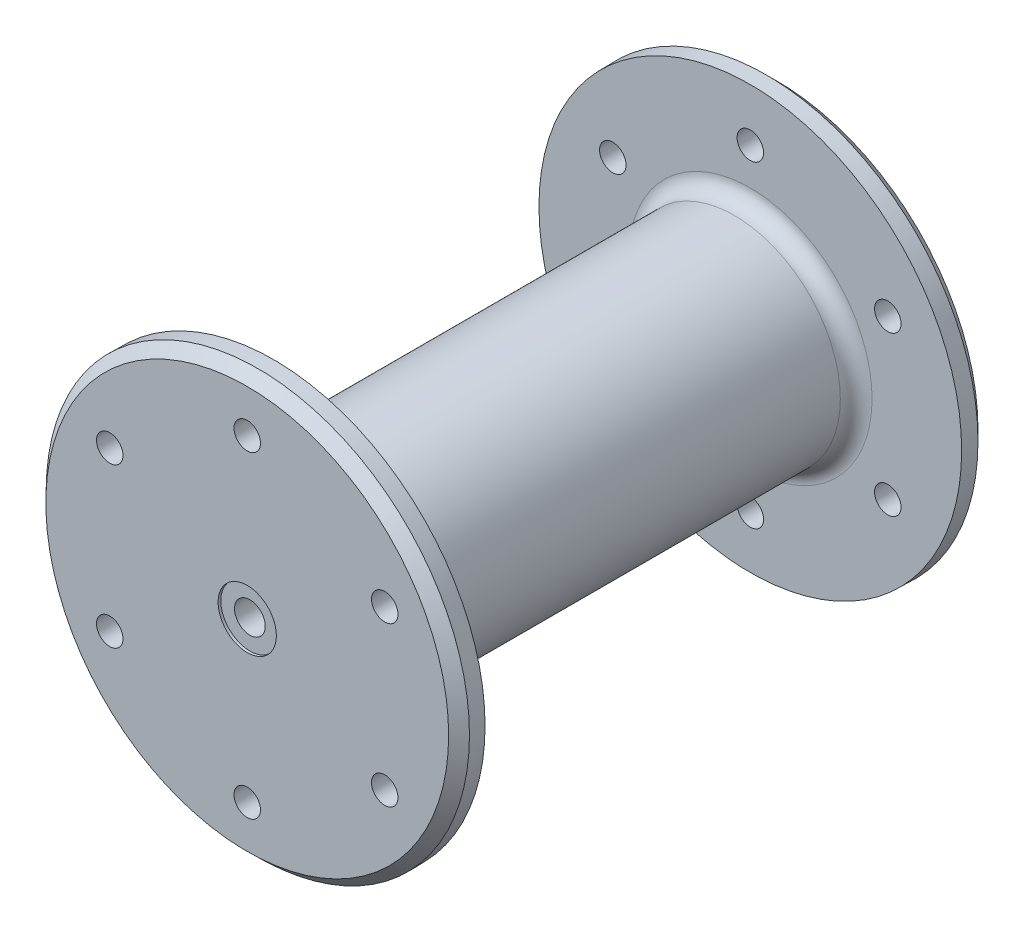
ISO-10303-21;
HEADER;
FILE_DESCRIPTION(('STEP AP214'),'2;1');
FILE_NAME('part.step','',(''),(''),'','','');
FILE_SCHEMA(('AUTOMOTIVE_DESIGN { 1 0 10303 214 1 1 1 1 }'));
ENDSEC;
DATA;
#1=APPLICATION_CONTEXT('core data for automotive mechanical design processes');
#2=APPLICATION_PROTOCOL_DEFINITION('international standard','automotive_design',2000,#1);
#3=PRODUCT_CONTEXT('',#1,'mechanical');
#4=PRODUCT('Part','Part','',(#3));
#5=PRODUCT_RELATED_PRODUCT_CATEGORY('part','',(#4));
#6=PRODUCT_DEFINITION_FORMATION('','',#4);
#7=PRODUCT_DEFINITION_CONTEXT('part definition',#1,'design');
#8=PRODUCT_DEFINITION('design','',#6,#7);
#9=PRODUCT_DEFINITION_SHAPE('','',#8);
#10=(LENGTH_UNIT() NAMED_UNIT(*) SI_UNIT(.MILLI.,.METRE.));
#11=(NAMED_UNIT(*) PLANE_ANGLE_UNIT() SI_UNIT($,.RADIAN.));
#12=(NAMED_UNIT(*) SI_UNIT($,.STERADIAN.) SOLID_ANGLE_UNIT());
#13=UNCERTAINTY_MEASURE_WITH_UNIT(LENGTH_MEASURE(1.E-05),#10,'distance_accuracy_value','');
#14=(GEOMETRIC_REPRESENTATION_CONTEXT(3) GLOBAL_UNCERTAINTY_ASSIGNED_CONTEXT((#13)) GLOBAL_UNIT_ASSIGNED_CONTEXT((#10,
#11,#12)) REPRESENTATION_CONTEXT('',''));
#15=CARTESIAN_POINT('',(0.,0.,0.));
#16=DIRECTION('',(0.,0.,1.));
#17=DIRECTION('',(1.,0.,0.));
#18=AXIS2_PLACEMENT_3D('',#15,#16,#17);
#19=CARTESIAN_POINT('',(0.,0.,50.));
#20=DIRECTION('',(0.,0.,-1.));
#21=DIRECTION('',(-1.,0.,0.));
#22=AXIS2_PLACEMENT_3D('',#19,#20,#21);
#23=CYLINDRICAL_SURFACE('',#22,20.);
#24=CARTESIAN_POINT('',(0.,0.,-42.));
#25=DIRECTION('',(0.,0.,-1.));
#26=DIRECTION('',(-1.,0.,0.));
#27=AXIS2_PLACEMENT_3D('',#24,#25,#26);
#28=CIRCLE('',#27,20.);
#29=CARTESIAN_POINT('',(-20.,0.,-42.));
#30=VERTEX_POINT('',#29);
#31=EDGE_CURVE('E10',#30,#30,#28,.F.);
#32=ORIENTED_EDGE('',*,*,#31,.T.);
#33=EDGE_LOOP('',(#32));
#34=FACE_BOUND('',#33,.T.);
#35=CARTESIAN_POINT('',(0.,0.,42.));
#36=DIRECTION('',(0.,0.,1.));
#37=DIRECTION('',(1.,0.,0.));
#38=AXIS2_PLACEMENT_3D('',#35,#36,#37);
#39=CIRCLE('',#38,20.);
#40=CARTESIAN_POINT('',(20.,0.,42.));
#41=VERTEX_POINT('',#40);
#42=EDGE_CURVE('E61',#41,#41,#39,.F.);
#43=ORIENTED_EDGE('',*,*,#42,.T.);
#44=EDGE_LOOP('',(#43));
#45=FACE_BOUND('',#44,.T.);
#46=ADVANCED_FACE('F37',(#34,#45),#23,.T.);
#47=CARTESIAN_POINT('',(0.,0.,50.));
#48=DIRECTION('',(0.,0.,1.));
#49=DIRECTION('',(1.,0.,0.));
#50=AXIS2_PLACEMENT_3D('',#47,#48,#49);
#51=CYLINDRICAL_SURFACE('',#50,2.89999999999999);
#52=CARTESIAN_POINT('',(0.,0.,49.5));
#53=DIRECTION('',(0.,0.,1.));
#54=DIRECTION('',(1.,0.,0.));
#55=AXIS2_PLACEMENT_3D('',#52,#53,#54);
#56=CIRCLE('',#55,2.9);
#57=CARTESIAN_POINT('',(2.9,0.,49.5));
#58=VERTEX_POINT('',#57);
#59=EDGE_CURVE('E119',#58,#58,#56,.T.);
#60=ORIENTED_EDGE('',*,*,#59,.T.);
#61=EDGE_LOOP('',(#60));
#62=FACE_BOUND('',#61,.T.);
#63=CARTESIAN_POINT('',(0.,0.,-49.5));
#64=DIRECTION('',(0.,0.,-1.));
#65=DIRECTION('',(-1.,0.,0.));
#66=AXIS2_PLACEMENT_3D('',#63,#64,#65);
#67=CIRCLE('',#66,2.9);
#68=CARTESIAN_POINT('',(-2.9,0.,-49.5));
#69=VERTEX_POINT('',#68);
#70=EDGE_CURVE('E193',#69,#69,#67,.T.);
#71=ORIENTED_EDGE('',*,*,#70,.T.);
#72=EDGE_LOOP('',(#71));
#73=FACE_BOUND('',#72,.T.);
#74=ADVANCED_FACE('F251',(#62,#73),#51,.F.);
#75=CARTESIAN_POINT('',(0.,0.,50.));
#76=DIRECTION('',(0.,0.,1.));
#77=DIRECTION('',(1.,0.,0.));
#78=AXIS2_PLACEMENT_3D('',#75,#76,#77);
#79=CONICAL_SURFACE('',#78,40.,0.0174532925199433);
#80=CARTESIAN_POINT('',(0.,0.,48.0003046096873));
#81=DIRECTION('',(0.,0.,-1.));
#82=DIRECTION('',(-1.,0.,0.));
#83=AXIS2_PLACEMENT_3D('',#80,#81,#82);
#84=CIRCLE('',#83,39.9650951871254);
#85=CARTESIAN_POINT('',(-39.9650951871254,0.,48.0003046096873));
#86=VERTEX_POINT('',#85);
#87=EDGE_CURVE('E69',#86,#86,#84,.T.);
#88=ORIENTED_EDGE('',*,*,#87,.T.);
#89=EDGE_LOOP('',(#88));
#90=FACE_BOUND('',#89,.T.);
#91=CARTESIAN_POINT('',(0.,0.,45.));
#92=DIRECTION('',(0.,0.,1.));
#93=DIRECTION('',(1.,0.,0.));
#94=AXIS2_PLACEMENT_3D('',#91,#92,#93);
#95=CIRCLE('',#94,39.9127246753589);
#96=CARTESIAN_POINT('',(39.9127246753589,0.,45.));
#97=VERTEX_POINT('',#96);
#98=EDGE_CURVE('E77',#97,#97,#95,.T.);
#99=ORIENTED_EDGE('',*,*,#98,.T.);
#100=EDGE_LOOP('',(#99));
#101=FACE_BOUND('',#100,.T.);
#102=ADVANCED_FACE('F256',(#90,#101),#79,.T.);
#103=CARTESIAN_POINT('',(0.,0.,45.));
#104=DIRECTION('',(0.,0.,1.));
#105=DIRECTION('',(1.,0.,0.));
#106=AXIS2_PLACEMENT_3D('',#103,#104,#105);
#107=PLANE('',#106);
#108=CARTESIAN_POINT('',(0.,0.,45.));
#109=DIRECTION('',(0.,0.,1.));
#110=DIRECTION('',(1.,0.,0.));
#111=AXIS2_PLACEMENT_3D('',#108,#109,#110);
#112=CIRCLE('',#111,23.);
#113=CARTESIAN_POINT('',(23.,0.,45.));
#114=VERTEX_POINT('',#113);
#115=EDGE_CURVE('E65',#114,#114,#112,.T.);
#116=ORIENTED_EDGE('',*,*,#115,.T.);
#117=EDGE_LOOP('',(#116));
#118=FACE_BOUND('',#117,.T.);
#119=CARTESIAN_POINT('',(-25.9656478862011,14.9912737967817,45.));
#120=DIRECTION('',(0.,0.,1.));
#121=DIRECTION('',(1.,0.,0.));
#122=AXIS2_PLACEMENT_3D('',#119,#120,#121);
#123=CIRCLE('',#122,2.5);
#124=CARTESIAN_POINT('',(-23.4656478862011,14.9912737967817,45.));
#125=VERTEX_POINT('',#124);
#126=EDGE_CURVE('E89',#125,#125,#123,.T.);
#127=ORIENTED_EDGE('',*,*,#126,.T.);
#128=EDGE_LOOP('',(#127));
#129=FACE_BOUND('',#128,.T.);
#130=CARTESIAN_POINT('',(-25.9656478862014,-14.9912737967811,45.));
#131=DIRECTION('',(0.,0.,1.));
#132=DIRECTION('',(1.,0.,0.));
#133=AXIS2_PLACEMENT_3D('',#130,#131,#132);
#134=CIRCLE('',#133,2.5);
#135=CARTESIAN_POINT('',(-23.4656478862014,-14.9912737967811,45.));
#136=VERTEX_POINT('',#135);
#137=EDGE_CURVE('E93',#136,#136,#134,.T.);
#138=ORIENTED_EDGE('',*,*,#137,.T.);
#139=EDGE_LOOP('',(#138));
#140=FACE_BOUND('',#139,.T.);
#141=CARTESIAN_POINT('',(0.,-29.9825475935627,45.));
#142=DIRECTION('',(0.,0.,1.));
#143=DIRECTION('',(1.,0.,0.));
#144=AXIS2_PLACEMENT_3D('',#141,#142,#143);
#145=CIRCLE('',#144,2.5);
#146=CARTESIAN_POINT('',(2.5,-29.9825475935627,45.));
#147=VERTEX_POINT('',#146);
#148=EDGE_CURVE('E97',#147,#147,#145,.T.);
#149=ORIENTED_EDGE('',*,*,#148,.T.);
#150=EDGE_LOOP('',(#149));
#151=FACE_BOUND('',#150,.T.);
#152=CARTESIAN_POINT('',(25.9656478862012,-14.9912737967815,45.));
#153=DIRECTION('',(0.,0.,1.));
#154=DIRECTION('',(1.,0.,0.));
#155=AXIS2_PLACEMENT_3D('',#152,#153,#154);
#156=CIRCLE('',#155,2.5);
#157=CARTESIAN_POINT('',(28.4656478862012,-14.9912737967815,45.));
#158=VERTEX_POINT('',#157);
#159=EDGE_CURVE('E101',#158,#158,#156,.T.);
#160=ORIENTED_EDGE('',*,*,#159,.T.);
#161=EDGE_LOOP('',(#160));
#162=FACE_BOUND('',#161,.T.);
#163=CARTESIAN_POINT('',(25.9656478862013,14.9912737967813,45.));
#164=DIRECTION('',(0.,0.,1.));
#165=DIRECTION('',(1.,0.,0.));
#166=AXIS2_PLACEMENT_3D('',#163,#164,#165);
#167=CIRCLE('',#166,2.5);
#168=CARTESIAN_POINT('',(28.4656478862013,14.9912737967813,45.));
#169=VERTEX_POINT('',#168);
#170=EDGE_CURVE('E105',#169,#169,#167,.T.);
#171=ORIENTED_EDGE('',*,*,#170,.T.);
#172=EDGE_LOOP('',(#171));
#173=FACE_BOUND('',#172,.T.);
#174=CARTESIAN_POINT('',(0.,29.9825475935627,45.));
#175=DIRECTION('',(0.,0.,1.));
#176=DIRECTION('',(1.,0.,0.));
#177=AXIS2_PLACEMENT_3D('',#174,#175,#176);
#178=CIRCLE('',#177,2.5);
#179=CARTESIAN_POINT('',(2.5,29.9825475935627,45.));
#180=VERTEX_POINT('',#179);
#181=EDGE_CURVE('E81',#180,#180,#178,.T.);
#182=ORIENTED_EDGE('',*,*,#181,.T.);
#183=EDGE_LOOP('',(#182));
#184=FACE_BOUND('',#183,.T.);
#185=ORIENTED_EDGE('',*,*,#98,.F.);
#186=EDGE_LOOP('',(#185));
#187=FACE_BOUND('',#186,.T.);
#188=ADVANCED_FACE('F285',(#118,#129,#140,#151,#162,#173,#184,#187),#107,.F.);
#189=CARTESIAN_POINT('',(0.,0.,50.));
#190=DIRECTION('',(0.,0.,1.));
#191=DIRECTION('',(1.,0.,0.));
#192=AXIS2_PLACEMENT_3D('',#189,#190,#191);
#193=PLANE('',#192);
#194=CARTESIAN_POINT('',(0.,0.,50.));
#195=DIRECTION('',(0.,0.,1.));
#196=DIRECTION('',(1.,0.,0.));
#197=AXIS2_PLACEMENT_3D('',#194,#195,#196);
#198=CIRCLE('',#197,5.49999999999999);
#199=CARTESIAN_POINT('',(5.49999999999999,0.,50.));
#200=VERTEX_POINT('',#199);
#201=EDGE_CURVE('E137',#200,#200,#198,.T.);
#202=ORIENTED_EDGE('',*,*,#201,.F.);
#203=EDGE_LOOP('',(#202));
#204=FACE_BOUND('',#203,.T.);
#205=CARTESIAN_POINT('',(-25.9656478862011,14.9912737967817,50.));
#206=DIRECTION('',(0.,0.,1.));
#207=DIRECTION('',(0.50000000000001,0.866025403784433,0.));
#208=AXIS2_PLACEMENT_3D('',#205,#206,#207);
#209=CIRCLE('',#208,2.5);
#210=CARTESIAN_POINT('',(-24.7156478862011,17.1563373062427,50.));
#211=VERTEX_POINT('',#210);
#212=EDGE_CURVE('E114',#211,#211,#209,.T.);
#213=ORIENTED_EDGE('',*,*,#212,.F.);
#214=EDGE_LOOP('',(#213));
#215=FACE_BOUND('',#214,.T.);
#216=CARTESIAN_POINT('',(-25.9656478862014,-14.9912737967811,50.));
#217=DIRECTION('',(0.,0.,1.));
#218=DIRECTION('',(-0.499999999999992,0.866025403784443,0.));
#219=AXIS2_PLACEMENT_3D('',#216,#217,#218);
#220=CIRCLE('',#219,2.5);
#221=CARTESIAN_POINT('',(-27.2156478862014,-12.82621028732,50.));
#222=VERTEX_POINT('',#221);
#223=EDGE_CURVE('E118',#222,#222,#220,.T.);
#224=ORIENTED_EDGE('',*,*,#223,.F.);
#225=EDGE_LOOP('',(#224));
#226=FACE_BOUND('',#225,.T.);
#227=CARTESIAN_POINT('',(0.,-29.9825475935627,50.));
#228=DIRECTION('',(0.,0.,1.));
#229=DIRECTION('',(-1.,0.,0.));
#230=AXIS2_PLACEMENT_3D('',#227,#228,#229);
#231=CIRCLE('',#230,2.5);
#232=CARTESIAN_POINT('',(-2.5,-29.9825475935627,50.));
#233=VERTEX_POINT('',#232);
#234=EDGE_CURVE('E123',#233,#233,#231,.T.);
#235=ORIENTED_EDGE('',*,*,#234,.F.);
#236=EDGE_LOOP('',(#235));
#237=FACE_BOUND('',#236,.T.);
#238=CARTESIAN_POINT('',(25.9656478862012,-14.9912737967815,50.));
#239=DIRECTION('',(0.,0.,1.));
#240=DIRECTION('',(-0.500000000000004,-0.866025403784436,0.));
#241=AXIS2_PLACEMENT_3D('',#238,#239,#240);
#242=CIRCLE('',#241,2.5);
#243=CARTESIAN_POINT('',(24.7156478862012,-17.1563373062426,50.));
#244=VERTEX_POINT('',#243);
#245=EDGE_CURVE('E113',#244,#244,#242,.T.);
#246=ORIENTED_EDGE('',*,*,#245,.F.);
#247=EDGE_LOOP('',(#246));
#248=FACE_BOUND('',#247,.T.);
#249=CARTESIAN_POINT('',(25.9656478862013,14.9912737967813,50.));
#250=DIRECTION('',(0.,0.,1.));
#251=DIRECTION('',(0.499999999999998,-0.86602540378444,0.));
#252=AXIS2_PLACEMENT_3D('',#249,#250,#251);
#253=CIRCLE('',#252,2.5);
#254=CARTESIAN_POINT('',(27.2156478862013,12.8262102873202,50.));
#255=VERTEX_POINT('',#254);
#256=EDGE_CURVE('E109',#255,#255,#253,.T.);
#257=ORIENTED_EDGE('',*,*,#256,.F.);
#258=EDGE_LOOP('',(#257));
#259=FACE_BOUND('',#258,.T.);
#260=CARTESIAN_POINT('',(0.,29.9825475935627,50.));
#261=DIRECTION('',(0.,0.,1.));
#262=DIRECTION('',(1.,0.,0.));
#263=AXIS2_PLACEMENT_3D('',#260,#261,#262);
#264=CIRCLE('',#263,2.5);
#265=CARTESIAN_POINT('',(2.5,29.9825475935627,50.));
#266=VERTEX_POINT('',#265);
#267=EDGE_CURVE('E85',#266,#266,#264,.T.);
#268=ORIENTED_EDGE('',*,*,#267,.F.);
#269=EDGE_LOOP('',(#268));
#270=FACE_BOUND('',#269,.T.);
#271=CARTESIAN_POINT('',(0.,0.,50.));
#272=DIRECTION('',(0.,0.,1.));
#273=DIRECTION('',(1.,0.,0.));
#274=AXIS2_PLACEMENT_3D('',#271,#272,#273);
#275=CIRCLE('',#274,38.034011795667);
#276=CARTESIAN_POINT('',(38.034011795667,0.,50.));
#277=VERTEX_POINT('',#276);
#278=EDGE_CURVE('E73',#277,#277,#275,.T.);
#279=ORIENTED_EDGE('',*,*,#278,.T.);
#280=EDGE_LOOP('',(#279));
#281=FACE_BOUND('',#280,.T.);
#282=ADVANCED_FACE('F266',(#204,#215,#226,#237,#248,#259,#270,#281),#193,.T.);
#283=CARTESIAN_POINT('',(0.,0.,50.));
#284=DIRECTION('',(0.,0.,-1.));
#285=DIRECTION('',(-1.,0.,0.));
#286=AXIS2_PLACEMENT_3D('',#283,#284,#285);
#287=CONICAL_SURFACE('',#286,38.034011795667,0.767944870877499);
#288=ORIENTED_EDGE('',*,*,#87,.F.);
#289=EDGE_LOOP('',(#288));
#290=FACE_BOUND('',#289,.T.);
#291=ORIENTED_EDGE('',*,*,#278,.F.);
#292=EDGE_LOOP('',(#291));
#293=FACE_BOUND('',#292,.T.);
#294=ADVANCED_FACE('F262',(#290,#293),#287,.T.);
#295=CARTESIAN_POINT('',(0.,29.9825475935627,-50.));
#296=DIRECTION('',(0.,0.,1.));
#297=DIRECTION('',(1.,0.,0.));
#298=AXIS2_PLACEMENT_3D('',#295,#296,#297);
#299=CYLINDRICAL_SURFACE('',#298,2.5);
#300=ORIENTED_EDGE('',*,*,#267,.T.);
#301=EDGE_LOOP('',(#300));
#302=FACE_BOUND('',#301,.T.);
#303=ORIENTED_EDGE('',*,*,#181,.F.);
#304=EDGE_LOOP('',(#303));
#305=FACE_BOUND('',#304,.T.);
#306=ADVANCED_FACE('F265',(#302,#305),#299,.F.);
#307=CARTESIAN_POINT('',(25.9656478862013,14.9912737967813,-50.));
#308=DIRECTION('',(0.,0.,1.));
#309=DIRECTION('',(1.,0.,0.));
#310=AXIS2_PLACEMENT_3D('',#307,#308,#309);
#311=CYLINDRICAL_SURFACE('',#310,2.5);
#312=ORIENTED_EDGE('',*,*,#256,.T.);
#313=EDGE_LOOP('',(#312));
#314=FACE_BOUND('',#313,.T.);
#315=ORIENTED_EDGE('',*,*,#170,.F.);
#316=EDGE_LOOP('',(#315));
#317=FACE_BOUND('',#316,.T.);
#318=ADVANCED_FACE('F332',(#314,#317),#311,.F.);
#319=CARTESIAN_POINT('',(25.9656478862012,-14.9912737967815,-50.));
#320=DIRECTION('',(0.,0.,1.));
#321=DIRECTION('',(1.,0.,0.));
#322=AXIS2_PLACEMENT_3D('',#319,#320,#321);
#323=CYLINDRICAL_SURFACE('',#322,2.5);
#324=ORIENTED_EDGE('',*,*,#245,.T.);
#325=EDGE_LOOP('',(#324));
#326=FACE_BOUND('',#325,.T.);
#327=ORIENTED_EDGE('',*,*,#159,.F.);
#328=EDGE_LOOP('',(#327));
#329=FACE_BOUND('',#328,.T.);
#330=ADVANCED_FACE('F336',(#326,#329),#323,.F.);
#331=CARTESIAN_POINT('',(0.,-29.9825475935627,-50.));
#332=DIRECTION('',(0.,0.,1.));
#333=DIRECTION('',(1.,0.,0.));
#334=AXIS2_PLACEMENT_3D('',#331,#332,#333);
#335=CYLINDRICAL_SURFACE('',#334,2.5);
#336=ORIENTED_EDGE('',*,*,#234,.T.);
#337=EDGE_LOOP('',(#336));
#338=FACE_BOUND('',#337,.T.);
#339=ORIENTED_EDGE('',*,*,#148,.F.);
#340=EDGE_LOOP('',(#339));
#341=FACE_BOUND('',#340,.T.);
#342=ADVANCED_FACE('F342',(#338,#341),#335,.F.);
#343=CARTESIAN_POINT('',(-25.9656478862014,-14.9912737967811,-50.));
#344=DIRECTION('',(0.,0.,1.));
#345=DIRECTION('',(1.,0.,0.));
#346=AXIS2_PLACEMENT_3D('',#343,#344,#345);
#347=CYLINDRICAL_SURFACE('',#346,2.5);
#348=ORIENTED_EDGE('',*,*,#223,.T.);
#349=EDGE_LOOP('',(#348));
#350=FACE_BOUND('',#349,.T.);
#351=ORIENTED_EDGE('',*,*,#137,.F.);
#352=EDGE_LOOP('',(#351));
#353=FACE_BOUND('',#352,.T.);
#354=ADVANCED_FACE('F278',(#350,#353),#347,.F.);
#355=CARTESIAN_POINT('',(-25.9656478862011,14.9912737967817,-50.));
#356=DIRECTION('',(0.,0.,1.));
#357=DIRECTION('',(1.,0.,0.));
#358=AXIS2_PLACEMENT_3D('',#355,#356,#357);
#359=CYLINDRICAL_SURFACE('',#358,2.5);
#360=ORIENTED_EDGE('',*,*,#212,.T.);
#361=EDGE_LOOP('',(#360));
#362=FACE_BOUND('',#361,.T.);
#363=ORIENTED_EDGE('',*,*,#126,.F.);
#364=EDGE_LOOP('',(#363));
#365=FACE_BOUND('',#364,.T.);
#366=ADVANCED_FACE('F270',(#362,#365),#359,.F.);
#367=CARTESIAN_POINT('',(0.,0.,42.));
#368=DIRECTION('',(0.,0.,1.));
#369=DIRECTION('',(1.,0.,0.));
#370=AXIS2_PLACEMENT_3D('',#367,#368,#369);
#371=TOROIDAL_SURFACE('',#370,23.,3.);
#372=ORIENTED_EDGE('',*,*,#42,.F.);
#373=EDGE_LOOP('',(#372));
#374=FACE_BOUND('',#373,.T.);
#375=ORIENTED_EDGE('',*,*,#115,.F.);
#376=EDGE_LOOP('',(#375));
#377=FACE_BOUND('',#376,.T.);
#378=ADVANCED_FACE('F268',(#374,#377),#371,.F.);
#379=CARTESIAN_POINT('',(2.9,0.,49.5));
#380=DIRECTION('',(0.,0.,-1.));
#381=DIRECTION('',(-1.,0.,0.));
#382=AXIS2_PLACEMENT_3D('',#379,#380,#381);
#383=PLANE('',#382);
#384=ORIENTED_EDGE('',*,*,#59,.F.);
#385=EDGE_LOOP('',(#384));
#386=FACE_BOUND('',#385,.T.);
#387=CARTESIAN_POINT('',(0.,0.,49.5));
#388=DIRECTION('',(0.,0.,1.));
#389=DIRECTION('',(1.,0.,0.));
#390=AXIS2_PLACEMENT_3D('',#387,#388,#389);
#391=CIRCLE('',#390,5.5);
#392=CARTESIAN_POINT('',(5.5,0.,49.5));
#393=VERTEX_POINT('',#392);
#394=EDGE_CURVE('E133',#393,#393,#391,.T.);
#395=ORIENTED_EDGE('',*,*,#394,.T.);
#396=EDGE_LOOP('',(#395));
#397=FACE_BOUND('',#396,.T.);
#398=ADVANCED_FACE('F245',(#386,#397),#383,.F.);
#399=CARTESIAN_POINT('',(0.,0.,50.));
#400=DIRECTION('',(0.,0.,1.));
#401=DIRECTION('',(1.,0.,0.));
#402=AXIS2_PLACEMENT_3D('',#399,#400,#401);
#403=CYLINDRICAL_SURFACE('',#402,5.5);
#404=ORIENTED_EDGE('',*,*,#394,.F.);
#405=EDGE_LOOP('',(#404));
#406=FACE_BOUND('',#405,.T.);
#407=ORIENTED_EDGE('',*,*,#201,.T.);
#408=EDGE_LOOP('',(#407));
#409=FACE_BOUND('',#408,.T.);
#410=ADVANCED_FACE('F240',(#406,#409),#403,.F.);
#411=CARTESIAN_POINT('',(0.,0.,-45.));
#412=DIRECTION('',(0.,0.,-1.));
#413=DIRECTION('',(1.,0.,0.));
#414=AXIS2_PLACEMENT_3D('',#411,#412,#413);
#415=PLANE('',#414);
#416=CARTESIAN_POINT('',(0.,0.,-45.));
#417=DIRECTION('',(0.,0.,-1.));
#418=DIRECTION('',(-1.,0.,0.));
#419=AXIS2_PLACEMENT_3D('',#416,#417,#418);
#420=CIRCLE('',#419,23.);
#421=CARTESIAN_POINT('',(-23.,0.,-45.));
#422=VERTEX_POINT('',#421);
#423=EDGE_CURVE('E45',#422,#422,#420,.T.);
#424=ORIENTED_EDGE('',*,*,#423,.T.);
#425=EDGE_LOOP('',(#424));
#426=FACE_BOUND('',#425,.T.);
#427=CARTESIAN_POINT('',(-25.9656478862011,14.9912737967817,-45.));
#428=DIRECTION('',(0.,0.,-1.));
#429=DIRECTION('',(-1.,0.,0.));
#430=AXIS2_PLACEMENT_3D('',#427,#428,#429);
#431=CIRCLE('',#430,2.5);
#432=CARTESIAN_POINT('',(-28.4656478862011,14.9912737967817,-45.));
#433=VERTEX_POINT('',#432);
#434=EDGE_CURVE('E153',#433,#433,#431,.F.);
#435=ORIENTED_EDGE('',*,*,#434,.F.);
#436=EDGE_LOOP('',(#435));
#437=FACE_BOUND('',#436,.T.);
#438=CARTESIAN_POINT('',(-25.9656478862014,-14.9912737967811,-45.));
#439=DIRECTION('',(0.,0.,-1.));
#440=DIRECTION('',(-1.,0.,0.));
#441=AXIS2_PLACEMENT_3D('',#438,#439,#440);
#442=CIRCLE('',#441,2.5);
#443=CARTESIAN_POINT('',(-28.4656478862014,-14.9912737967811,-45.));
#444=VERTEX_POINT('',#443);
#445=EDGE_CURVE('E157',#444,#444,#442,.F.);
#446=ORIENTED_EDGE('',*,*,#445,.F.);
#447=EDGE_LOOP('',(#446));
#448=FACE_BOUND('',#447,.T.);
#449=CARTESIAN_POINT('',(0.,-29.9825475935627,-45.));
#450=DIRECTION('',(0.,0.,-1.));
#451=DIRECTION('',(-1.,0.,0.));
#452=AXIS2_PLACEMENT_3D('',#449,#450,#451);
#453=CIRCLE('',#452,2.5);
#454=CARTESIAN_POINT('',(-2.5,-29.9825475935627,-45.));
#455=VERTEX_POINT('',#454);
#456=EDGE_CURVE('E161',#455,#455,#453,.F.);
#457=ORIENTED_EDGE('',*,*,#456,.F.);
#458=EDGE_LOOP('',(#457));
#459=FACE_BOUND('',#458,.T.);
#460=CARTESIAN_POINT('',(25.9656478862012,-14.9912737967815,-45.));
#461=DIRECTION('',(0.,0.,-1.));
#462=DIRECTION('',(-1.,0.,0.));
#463=AXIS2_PLACEMENT_3D('',#460,#461,#462);
#464=CIRCLE('',#463,2.5);
#465=CARTESIAN_POINT('',(23.4656478862012,-14.9912737967815,-45.));
#466=VERTEX_POINT('',#465);
#467=EDGE_CURVE('E165',#466,#466,#464,.F.);
#468=ORIENTED_EDGE('',*,*,#467,.F.);
#469=EDGE_LOOP('',(#468));
#470=FACE_BOUND('',#469,.T.);
#471=CARTESIAN_POINT('',(25.9656478862013,14.9912737967813,-45.));
#472=DIRECTION('',(0.,0.,-1.));
#473=DIRECTION('',(-1.,0.,0.));
#474=AXIS2_PLACEMENT_3D('',#471,#472,#473);
#475=CIRCLE('',#474,2.5);
#476=CARTESIAN_POINT('',(23.4656478862013,14.9912737967813,-45.));
#477=VERTEX_POINT('',#476);
#478=EDGE_CURVE('E169',#477,#477,#475,.F.);
#479=ORIENTED_EDGE('',*,*,#478,.F.);
#480=EDGE_LOOP('',(#479));
#481=FACE_BOUND('',#480,.T.);
#482=CARTESIAN_POINT('',(0.,29.9825475935627,-45.));
#483=DIRECTION('',(0.,0.,-1.));
#484=DIRECTION('',(-1.,0.,0.));
#485=AXIS2_PLACEMENT_3D('',#482,#483,#484);
#486=CIRCLE('',#485,2.5);
#487=CARTESIAN_POINT('',(-2.5,29.9825475935627,-45.));
#488=VERTEX_POINT('',#487);
#489=EDGE_CURVE('E145',#488,#488,#486,.F.);
#490=ORIENTED_EDGE('',*,*,#489,.F.);
#491=EDGE_LOOP('',(#490));
#492=FACE_BOUND('',#491,.T.);
#493=CARTESIAN_POINT('',(0.,0.,-45.));
#494=DIRECTION('',(0.,0.,-1.));
#495=DIRECTION('',(-1.,0.,0.));
#496=AXIS2_PLACEMENT_3D('',#493,#494,#495);
#497=CIRCLE('',#496,39.9127246753589);
#498=CARTESIAN_POINT('',(-39.9127246753589,0.,-45.));
#499=VERTEX_POINT('',#498);
#500=EDGE_CURVE('E141',#499,#499,#497,.F.);
#501=ORIENTED_EDGE('',*,*,#500,.T.);
#502=EDGE_LOOP('',(#501));
#503=FACE_BOUND('',#502,.T.);
#504=ADVANCED_FACE('F235',(#426,#437,#448,#459,#470,#481,#492,#503),#415,.F.);
#505=CARTESIAN_POINT('',(0.,0.,-50.));
#506=DIRECTION('',(0.,0.,-1.));
#507=DIRECTION('',(1.,0.,0.));
#508=AXIS2_PLACEMENT_3D('',#505,#506,#507);
#509=CONICAL_SURFACE('',#508,40.,0.0174532925199433);
#510=CARTESIAN_POINT('',(0.,0.,-48.0343112251931));
#511=DIRECTION('',(0.,0.,1.));
#512=DIRECTION('',(1.,0.,0.));
#513=AXIS2_PLACEMENT_3D('',#510,#511,#512);
#514=CIRCLE('',#513,39.9656887748071);
#515=CARTESIAN_POINT('',(39.9656887748071,0.,-48.0343112251931));
#516=VERTEX_POINT('',#515);
#517=EDGE_CURVE('E55',#516,#516,#514,.T.);
#518=ORIENTED_EDGE('',*,*,#517,.T.);
#519=EDGE_LOOP('',(#518));
#520=FACE_BOUND('',#519,.T.);
#521=ORIENTED_EDGE('',*,*,#500,.F.);
#522=EDGE_LOOP('',(#521));
#523=FACE_BOUND('',#522,.T.);
#524=ADVANCED_FACE('F212',(#520,#523),#509,.T.);
#525=CARTESIAN_POINT('',(0.,0.,-50.));
#526=DIRECTION('',(0.,0.,1.));
#527=DIRECTION('',(1.,0.,0.));
#528=AXIS2_PLACEMENT_3D('',#525,#526,#527);
#529=PLANE('',#528);
#530=CARTESIAN_POINT('',(0.,0.,-50.));
#531=DIRECTION('',(0.,0.,-1.));
#532=DIRECTION('',(-1.,0.,0.));
#533=AXIS2_PLACEMENT_3D('',#530,#531,#532);
#534=CIRCLE('',#533,5.49999999999999);
#535=CARTESIAN_POINT('',(-5.49999999999999,0.,-50.));
#536=VERTEX_POINT('',#535);
#537=EDGE_CURVE('E201',#536,#536,#534,.T.);
#538=ORIENTED_EDGE('',*,*,#537,.F.);
#539=EDGE_LOOP('',(#538));
#540=FACE_BOUND('',#539,.T.);
#541=CARTESIAN_POINT('',(-25.9656478862011,14.9912737967817,-50.));
#542=DIRECTION('',(0.,0.,1.));
#543=DIRECTION('',(0.50000000000001,0.866025403784433,0.));
#544=AXIS2_PLACEMENT_3D('',#541,#542,#543);
#545=CIRCLE('',#544,2.5);
#546=CARTESIAN_POINT('',(-24.7156478862011,17.1563373062427,-50.));
#547=VERTEX_POINT('',#546);
#548=EDGE_CURVE('E179',#547,#547,#545,.T.);
#549=ORIENTED_EDGE('',*,*,#548,.T.);
#550=EDGE_LOOP('',(#549));
#551=FACE_BOUND('',#550,.T.);
#552=CARTESIAN_POINT('',(-25.9656478862014,-14.9912737967811,-50.));
#553=DIRECTION('',(0.,0.,1.));
#554=DIRECTION('',(-0.499999999999992,0.866025403784443,0.));
#555=AXIS2_PLACEMENT_3D('',#552,#553,#554);
#556=CIRCLE('',#555,2.5);
#557=CARTESIAN_POINT('',(-27.2156478862014,-12.82621028732,-50.));
#558=VERTEX_POINT('',#557);
#559=EDGE_CURVE('E174',#558,#558,#556,.T.);
#560=ORIENTED_EDGE('',*,*,#559,.T.);
#561=EDGE_LOOP('',(#560));
#562=FACE_BOUND('',#561,.T.);
#563=CARTESIAN_POINT('',(0.,-29.9825475935627,-50.));
#564=DIRECTION('',(0.,0.,1.));
#565=DIRECTION('',(-1.,0.,0.));
#566=AXIS2_PLACEMENT_3D('',#563,#564,#565);
#567=CIRCLE('',#566,2.5);
#568=CARTESIAN_POINT('',(-2.5,-29.9825475935627,-50.));
#569=VERTEX_POINT('',#568);
#570=EDGE_CURVE('E178',#569,#569,#567,.T.);
#571=ORIENTED_EDGE('',*,*,#570,.T.);
#572=EDGE_LOOP('',(#571));
#573=FACE_BOUND('',#572,.T.);
#574=CARTESIAN_POINT('',(25.9656478862012,-14.9912737967815,-50.));
#575=DIRECTION('',(0.,0.,1.));
#576=DIRECTION('',(-0.500000000000004,-0.866025403784436,0.));
#577=AXIS2_PLACEMENT_3D('',#574,#575,#576);
#578=CIRCLE('',#577,2.5);
#579=CARTESIAN_POINT('',(24.7156478862012,-17.1563373062426,-50.));
#580=VERTEX_POINT('',#579);
#581=EDGE_CURVE('E183',#580,#580,#578,.T.);
#582=ORIENTED_EDGE('',*,*,#581,.T.);
#583=EDGE_LOOP('',(#582));
#584=FACE_BOUND('',#583,.T.);
#585=CARTESIAN_POINT('',(25.9656478862013,14.9912737967813,-50.));
#586=DIRECTION('',(0.,0.,1.));
#587=DIRECTION('',(0.499999999999998,-0.86602540378444,0.));
#588=AXIS2_PLACEMENT_3D('',#585,#586,#587);
#589=CIRCLE('',#588,2.5);
#590=CARTESIAN_POINT('',(27.2156478862013,12.8262102873202,-50.));
#591=VERTEX_POINT('',#590);
#592=EDGE_CURVE('E173',#591,#591,#589,.T.);
#593=ORIENTED_EDGE('',*,*,#592,.T.);
#594=EDGE_LOOP('',(#593));
#595=FACE_BOUND('',#594,.T.);
#596=CARTESIAN_POINT('',(0.,29.9825475935627,-50.));
#597=DIRECTION('',(0.,0.,1.));
#598=DIRECTION('',(1.,0.,0.));
#599=AXIS2_PLACEMENT_3D('',#596,#597,#598);
#600=CIRCLE('',#599,2.5);
#601=CARTESIAN_POINT('',(2.5,29.9825475935627,-50.));
#602=VERTEX_POINT('',#601);
#603=EDGE_CURVE('E149',#602,#602,#600,.T.);
#604=ORIENTED_EDGE('',*,*,#603,.T.);
#605=EDGE_LOOP('',(#604));
#606=FACE_BOUND('',#605,.T.);
#607=CARTESIAN_POINT('',(0.,0.,-50.));
#608=DIRECTION('',(0.,0.,1.));
#609=DIRECTION('',(1.,0.,0.));
#610=AXIS2_PLACEMENT_3D('',#607,#608,#609);
#611=CIRCLE('',#610,38.);
#612=CARTESIAN_POINT('',(38.,0.,-50.));
#613=VERTEX_POINT('',#612);
#614=EDGE_CURVE('E50',#613,#613,#611,.F.);
#615=ORIENTED_EDGE('',*,*,#614,.T.);
#616=EDGE_LOOP('',(#615));
#617=FACE_BOUND('',#616,.T.);
#618=ADVANCED_FACE('F208',(#540,#551,#562,#573,#584,#595,#606,#617),#529,.F.);
#619=CARTESIAN_POINT('',(0.,0.,-48.0343112251929));
#620=DIRECTION('',(0.,0.,1.));
#621=DIRECTION('',(1.,0.,0.));
#622=AXIS2_PLACEMENT_3D('',#619,#620,#621);
#623=CONICAL_SURFACE('',#622,39.9656887748071,0.785398163397443);
#624=ORIENTED_EDGE('',*,*,#614,.F.);
#625=EDGE_LOOP('',(#624));
#626=FACE_BOUND('',#625,.T.);
#627=ORIENTED_EDGE('',*,*,#517,.F.);
#628=EDGE_LOOP('',(#627));
#629=FACE_BOUND('',#628,.T.);
#630=ADVANCED_FACE('F211',(#626,#629),#623,.T.);
#631=CARTESIAN_POINT('',(0.,29.9825475935627,50.));
#632=DIRECTION('',(0.,0.,-1.));
#633=DIRECTION('',(-1.,0.,0.));
#634=AXIS2_PLACEMENT_3D('',#631,#632,#633);
#635=CYLINDRICAL_SURFACE('',#634,2.5);
#636=ORIENTED_EDGE('',*,*,#603,.F.);
#637=EDGE_LOOP('',(#636));
#638=FACE_BOUND('',#637,.T.);
#639=ORIENTED_EDGE('',*,*,#489,.T.);
#640=EDGE_LOOP('',(#639));
#641=FACE_BOUND('',#640,.T.);
#642=ADVANCED_FACE('F230',(#638,#641),#635,.F.);
#643=CARTESIAN_POINT('',(25.9656478862013,14.9912737967813,50.));
#644=DIRECTION('',(0.,0.,-1.));
#645=DIRECTION('',(-1.,0.,0.));
#646=AXIS2_PLACEMENT_3D('',#643,#644,#645);
#647=CYLINDRICAL_SURFACE('',#646,2.5);
#648=ORIENTED_EDGE('',*,*,#592,.F.);
#649=EDGE_LOOP('',(#648));
#650=FACE_BOUND('',#649,.T.);
#651=ORIENTED_EDGE('',*,*,#478,.T.);
#652=EDGE_LOOP('',(#651));
#653=FACE_BOUND('',#652,.T.);
#654=ADVANCED_FACE('F440',(#650,#653),#647,.F.);
#655=CARTESIAN_POINT('',(25.9656478862012,-14.9912737967815,50.));
#656=DIRECTION('',(0.,0.,-1.));
#657=DIRECTION('',(-1.,0.,0.));
#658=AXIS2_PLACEMENT_3D('',#655,#656,#657);
#659=CYLINDRICAL_SURFACE('',#658,2.5);
#660=ORIENTED_EDGE('',*,*,#581,.F.);
#661=EDGE_LOOP('',(#660));
#662=FACE_BOUND('',#661,.T.);
#663=ORIENTED_EDGE('',*,*,#467,.T.);
#664=EDGE_LOOP('',(#663));
#665=FACE_BOUND('',#664,.T.);
#666=ADVANCED_FACE('F449',(#662,#665),#659,.F.);
#667=CARTESIAN_POINT('',(0.,-29.9825475935627,50.));
#668=DIRECTION('',(0.,0.,-1.));
#669=DIRECTION('',(-1.,0.,0.));
#670=AXIS2_PLACEMENT_3D('',#667,#668,#669);
#671=CYLINDRICAL_SURFACE('',#670,2.5);
#672=ORIENTED_EDGE('',*,*,#570,.F.);
#673=EDGE_LOOP('',(#672));
#674=FACE_BOUND('',#673,.T.);
#675=ORIENTED_EDGE('',*,*,#456,.T.);
#676=EDGE_LOOP('',(#675));
#677=FACE_BOUND('',#676,.T.);
#678=ADVANCED_FACE('F459',(#674,#677),#671,.F.);
#679=CARTESIAN_POINT('',(-25.9656478862014,-14.9912737967811,50.));
#680=DIRECTION('',(0.,0.,-1.));
#681=DIRECTION('',(-1.,0.,0.));
#682=AXIS2_PLACEMENT_3D('',#679,#680,#681);
#683=CYLINDRICAL_SURFACE('',#682,2.5);
#684=ORIENTED_EDGE('',*,*,#559,.F.);
#685=EDGE_LOOP('',(#684));
#686=FACE_BOUND('',#685,.T.);
#687=ORIENTED_EDGE('',*,*,#445,.T.);
#688=EDGE_LOOP('',(#687));
#689=FACE_BOUND('',#688,.T.);
#690=ADVANCED_FACE('F469',(#686,#689),#683,.F.);
#691=CARTESIAN_POINT('',(-25.9656478862011,14.9912737967817,50.));
#692=DIRECTION('',(0.,0.,-1.));
#693=DIRECTION('',(-1.,0.,0.));
#694=AXIS2_PLACEMENT_3D('',#691,#692,#693);
#695=CYLINDRICAL_SURFACE('',#694,2.5);
#696=ORIENTED_EDGE('',*,*,#548,.F.);
#697=EDGE_LOOP('',(#696));
#698=FACE_BOUND('',#697,.T.);
#699=ORIENTED_EDGE('',*,*,#434,.T.);
#700=EDGE_LOOP('',(#699));
#701=FACE_BOUND('',#700,.T.);
#702=ADVANCED_FACE('F479',(#698,#701),#695,.F.);
#703=CARTESIAN_POINT('',(0.,0.,-42.));
#704=DIRECTION('',(0.,0.,-1.));
#705=DIRECTION('',(-1.,0.,0.));
#706=AXIS2_PLACEMENT_3D('',#703,#704,#705);
#707=TOROIDAL_SURFACE('',#706,23.,3.);
#708=ORIENTED_EDGE('',*,*,#31,.F.);
#709=EDGE_LOOP('',(#708));
#710=FACE_BOUND('',#709,.T.);
#711=ORIENTED_EDGE('',*,*,#423,.F.);
#712=EDGE_LOOP('',(#711));
#713=FACE_BOUND('',#712,.T.);
#714=ADVANCED_FACE('F39',(#710,#713),#707,.F.);
#715=CARTESIAN_POINT('',(2.9,0.,-49.5));
#716=DIRECTION('',(0.,0.,1.));
#717=DIRECTION('',(1.,0.,0.));
#718=AXIS2_PLACEMENT_3D('',#715,#716,#717);
#719=PLANE('',#718);
#720=ORIENTED_EDGE('',*,*,#70,.F.);
#721=EDGE_LOOP('',(#720));
#722=FACE_BOUND('',#721,.T.);
#723=CARTESIAN_POINT('',(0.,0.,-49.5));
#724=DIRECTION('',(0.,0.,-1.));
#725=DIRECTION('',(-1.,0.,0.));
#726=AXIS2_PLACEMENT_3D('',#723,#724,#725);
#727=CIRCLE('',#726,5.5);
#728=CARTESIAN_POINT('',(-5.5,0.,-49.5));
#729=VERTEX_POINT('',#728);
#730=EDGE_CURVE('E197',#729,#729,#727,.T.);
#731=ORIENTED_EDGE('',*,*,#730,.T.);
#732=EDGE_LOOP('',(#731));
#733=FACE_BOUND('',#732,.T.);
#734=ADVANCED_FACE('F497',(#722,#733),#719,.F.);
#735=CARTESIAN_POINT('',(0.,0.,-50.));
#736=DIRECTION('',(0.,0.,-1.));
#737=DIRECTION('',(-1.,0.,0.));
#738=AXIS2_PLACEMENT_3D('',#735,#736,#737);
#739=CYLINDRICAL_SURFACE('',#738,5.5);
#740=ORIENTED_EDGE('',*,*,#730,.F.);
#741=EDGE_LOOP('',(#740));
#742=FACE_BOUND('',#741,.T.);
#743=ORIENTED_EDGE('',*,*,#537,.T.);
#744=EDGE_LOOP('',(#743));
#745=FACE_BOUND('',#744,.T.);
#746=ADVANCED_FACE('F206',(#742,#745),#739,.F.);
#747=CLOSED_SHELL('',(#46,#74,#102,#188,#282,#294,#306,#318,#330,#342,#354,#366,#378,#398,#410,
#504,#524,#618,#630,#642,#654,#666,#678,#690,#702,#714,#734,#746));
#748=MANIFOLD_SOLID_BREP('B2',#747);
#749=ADVANCED_BREP_SHAPE_REPRESENTATION('',(#18,#748),#14);
#750=SHAPE_DEFINITION_REPRESENTATION(#9,#749);
ENDSEC;
END-ISO-10303-21;
